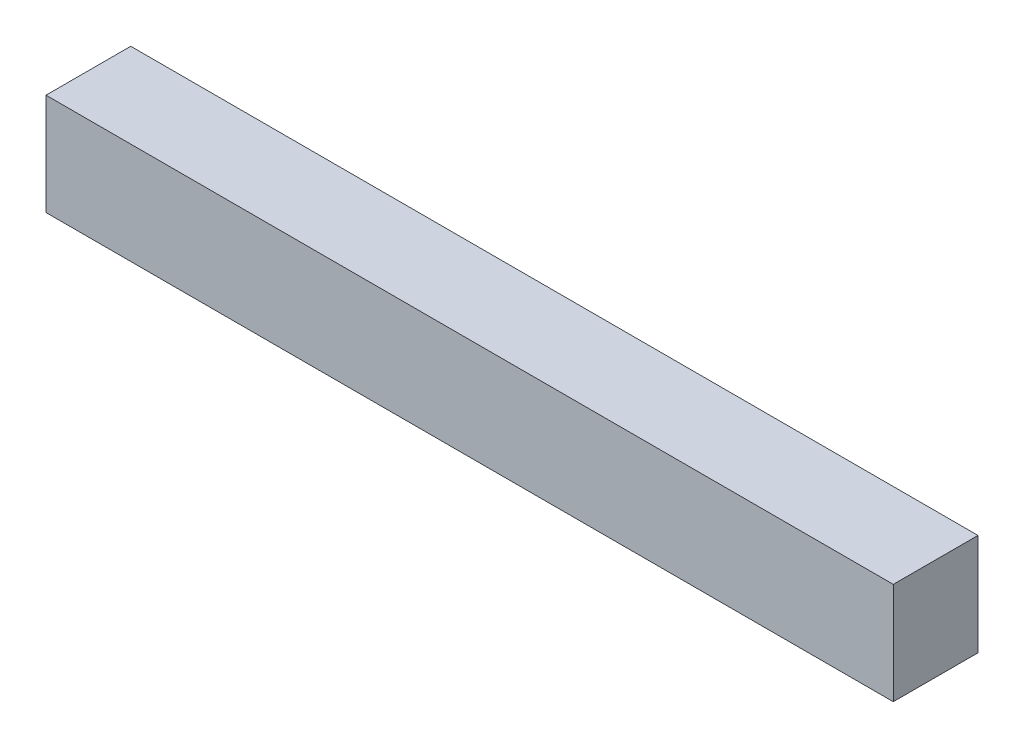
ISO-10303-21;
HEADER;
FILE_DESCRIPTION(('STEP AP214'),'2;1');
FILE_NAME('part.step','',(''),(''),'','','');
FILE_SCHEMA(('AUTOMOTIVE_DESIGN { 1 0 10303 214 1 1 1 1 }'));
ENDSEC;
DATA;
#1=APPLICATION_CONTEXT('core data for automotive mechanical design processes');
#2=APPLICATION_PROTOCOL_DEFINITION('international standard','automotive_design',2000,#1);
#3=PRODUCT_CONTEXT('',#1,'mechanical');
#4=PRODUCT('Part','Part','',(#3));
#5=PRODUCT_RELATED_PRODUCT_CATEGORY('part','',(#4));
#6=PRODUCT_DEFINITION_FORMATION('','',#4);
#7=PRODUCT_DEFINITION_CONTEXT('part definition',#1,'design');
#8=PRODUCT_DEFINITION('design','',#6,#7);
#9=PRODUCT_DEFINITION_SHAPE('','',#8);
#10=(LENGTH_UNIT() NAMED_UNIT(*) SI_UNIT(.MILLI.,.METRE.));
#11=(NAMED_UNIT(*) PLANE_ANGLE_UNIT() SI_UNIT($,.RADIAN.));
#12=(NAMED_UNIT(*) SI_UNIT($,.STERADIAN.) SOLID_ANGLE_UNIT());
#13=UNCERTAINTY_MEASURE_WITH_UNIT(LENGTH_MEASURE(1.E-05),#10,'distance_accuracy_value','');
#14=(GEOMETRIC_REPRESENTATION_CONTEXT(3) GLOBAL_UNCERTAINTY_ASSIGNED_CONTEXT((#13)) GLOBAL_UNIT_ASSIGNED_CONTEXT((#10,
#11,#12)) REPRESENTATION_CONTEXT('',''));
#15=CARTESIAN_POINT('',(0.,0.,0.));
#16=DIRECTION('',(0.,0.,1.));
#17=DIRECTION('',(1.,0.,0.));
#18=AXIS2_PLACEMENT_3D('',#15,#16,#17);
#19=CARTESIAN_POINT('',(25.,6.,-2.5));
#20=DIRECTION('',(-1.,0.,0.));
#21=DIRECTION('',(0.,0.,1.));
#22=AXIS2_PLACEMENT_3D('',#19,#20,#21);
#23=PLANE('',#22);
#24=DIRECTION('',(0.,0.,-1.));
#25=VECTOR('',#24,1.);
#26=CARTESIAN_POINT('',(25.,0.,-2.5));
#27=LINE('',#26,#25);
#28=CARTESIAN_POINT('',(25.,0.,2.5));
#29=VERTEX_POINT('',#28);
#30=CARTESIAN_POINT('',(25.,0.,-2.5));
#31=VERTEX_POINT('',#30);
#32=EDGE_CURVE('E98',#29,#31,#27,.T.);
#33=ORIENTED_EDGE('',*,*,#32,.T.);
#34=DIRECTION('',(0.,-1.,0.));
#35=VECTOR('',#34,1.);
#36=CARTESIAN_POINT('',(25.,6.,-2.5));
#37=LINE('',#36,#35);
#38=CARTESIAN_POINT('',(25.,6.,-2.5));
#39=VERTEX_POINT('',#38);
#40=EDGE_CURVE('E11',#39,#31,#37,.T.);
#41=ORIENTED_EDGE('',*,*,#40,.F.);
#42=DIRECTION('',(0.,0.,-1.));
#43=VECTOR('',#42,1.);
#44=CARTESIAN_POINT('',(25.,6.,-2.5));
#45=LINE('',#44,#43);
#46=CARTESIAN_POINT('',(25.,6.,2.5));
#47=VERTEX_POINT('',#46);
#48=EDGE_CURVE('E86',#47,#39,#45,.T.);
#49=ORIENTED_EDGE('',*,*,#48,.F.);
#50=DIRECTION('',(0.,-1.,0.));
#51=VECTOR('',#50,1.);
#52=CARTESIAN_POINT('',(25.,6.,2.5));
#53=LINE('',#52,#51);
#54=EDGE_CURVE('E94',#47,#29,#53,.T.);
#55=ORIENTED_EDGE('',*,*,#54,.T.);
#56=EDGE_LOOP('',(#33,#41,#49,#55));
#57=FACE_BOUND('',#56,.T.);
#58=ADVANCED_FACE('F35',(#57),#23,.F.);
#59=CARTESIAN_POINT('',(-25.,6.,-2.5));
#60=DIRECTION('',(0.,0.,1.));
#61=DIRECTION('',(1.,0.,0.));
#62=AXIS2_PLACEMENT_3D('',#59,#60,#61);
#63=PLANE('',#62);
#64=DIRECTION('',(-1.,0.,0.));
#65=VECTOR('',#64,1.);
#66=CARTESIAN_POINT('',(-25.,0.,-2.5));
#67=LINE('',#66,#65);
#68=CARTESIAN_POINT('',(-25.,0.,-2.5));
#69=VERTEX_POINT('',#68);
#70=EDGE_CURVE('E90',#31,#69,#67,.T.);
#71=ORIENTED_EDGE('',*,*,#70,.T.);
#72=DIRECTION('',(0.,-1.,0.));
#73=VECTOR('',#72,1.);
#74=CARTESIAN_POINT('',(-25.,6.,-2.5));
#75=LINE('',#74,#73);
#76=CARTESIAN_POINT('',(-25.,6.,-2.5));
#77=VERTEX_POINT('',#76);
#78=EDGE_CURVE('E43',#77,#69,#75,.T.);
#79=ORIENTED_EDGE('',*,*,#78,.F.);
#80=DIRECTION('',(-1.,0.,0.));
#81=VECTOR('',#80,1.);
#82=CARTESIAN_POINT('',(-25.,6.,-2.5));
#83=LINE('',#82,#81);
#84=EDGE_CURVE('E81',#39,#77,#83,.T.);
#85=ORIENTED_EDGE('',*,*,#84,.F.);
#86=ORIENTED_EDGE('',*,*,#40,.T.);
#87=EDGE_LOOP('',(#71,#79,#85,#86));
#88=FACE_BOUND('',#87,.T.);
#89=ADVANCED_FACE('F89',(#88),#63,.F.);
#90=CARTESIAN_POINT('',(-25.,6.,-2.5));
#91=DIRECTION('',(1.,0.,0.));
#92=DIRECTION('',(0.,0.,-1.));
#93=AXIS2_PLACEMENT_3D('',#90,#91,#92);
#94=PLANE('',#93);
#95=DIRECTION('',(0.,0.,1.));
#96=VECTOR('',#95,1.);
#97=CARTESIAN_POINT('',(-25.,0.,-2.5));
#98=LINE('',#97,#96);
#99=CARTESIAN_POINT('',(-25.,0.,2.5));
#100=VERTEX_POINT('',#99);
#101=EDGE_CURVE('E68',#69,#100,#98,.T.);
#102=ORIENTED_EDGE('',*,*,#101,.T.);
#103=DIRECTION('',(0.,-1.,0.));
#104=VECTOR('',#103,1.);
#105=CARTESIAN_POINT('',(-25.,6.,2.5));
#106=LINE('',#105,#104);
#107=CARTESIAN_POINT('',(-25.,6.,2.5));
#108=VERTEX_POINT('',#107);
#109=EDGE_CURVE('E91',#108,#100,#106,.T.);
#110=ORIENTED_EDGE('',*,*,#109,.F.);
#111=DIRECTION('',(0.,0.,1.));
#112=VECTOR('',#111,1.);
#113=CARTESIAN_POINT('',(-25.,6.,-2.5));
#114=LINE('',#113,#112);
#115=EDGE_CURVE('E84',#77,#108,#114,.T.);
#116=ORIENTED_EDGE('',*,*,#115,.F.);
#117=ORIENTED_EDGE('',*,*,#78,.T.);
#118=EDGE_LOOP('',(#102,#110,#116,#117));
#119=FACE_BOUND('',#118,.T.);
#120=ADVANCED_FACE('F92',(#119),#94,.F.);
#121=CARTESIAN_POINT('',(-25.,6.,2.5));
#122=DIRECTION('',(0.,0.,-1.));
#123=DIRECTION('',(-1.,0.,0.));
#124=AXIS2_PLACEMENT_3D('',#121,#122,#123);
#125=PLANE('',#124);
#126=DIRECTION('',(1.,0.,0.));
#127=VECTOR('',#126,1.);
#128=CARTESIAN_POINT('',(-25.,0.,2.5));
#129=LINE('',#128,#127);
#130=EDGE_CURVE('E74',#100,#29,#129,.T.);
#131=ORIENTED_EDGE('',*,*,#130,.T.);
#132=ORIENTED_EDGE('',*,*,#54,.F.);
#133=DIRECTION('',(1.,0.,0.));
#134=VECTOR('',#133,1.);
#135=CARTESIAN_POINT('',(-25.,6.,2.5));
#136=LINE('',#135,#134);
#137=EDGE_CURVE('E51',#108,#47,#136,.T.);
#138=ORIENTED_EDGE('',*,*,#137,.F.);
#139=ORIENTED_EDGE('',*,*,#109,.T.);
#140=EDGE_LOOP('',(#131,#132,#138,#139));
#141=FACE_BOUND('',#140,.T.);
#142=ADVANCED_FACE('F105',(#141),#125,.F.);
#143=CARTESIAN_POINT('',(0.,6.,0.));
#144=DIRECTION('',(0.,1.,0.));
#145=DIRECTION('',(0.,0.,1.));
#146=AXIS2_PLACEMENT_3D('',#143,#144,#145);
#147=PLANE('',#146);
#148=ORIENTED_EDGE('',*,*,#48,.T.);
#149=ORIENTED_EDGE('',*,*,#84,.T.);
#150=ORIENTED_EDGE('',*,*,#115,.T.);
#151=ORIENTED_EDGE('',*,*,#137,.T.);
#152=EDGE_LOOP('',(#148,#149,#150,#151));
#153=FACE_BOUND('',#152,.T.);
#154=ADVANCED_FACE('F82',(#153),#147,.T.);
#155=CARTESIAN_POINT('',(0.,0.,0.));
#156=DIRECTION('',(0.,1.,0.));
#157=DIRECTION('',(0.,0.,1.));
#158=AXIS2_PLACEMENT_3D('',#155,#156,#157);
#159=PLANE('',#158);
#160=ORIENTED_EDGE('',*,*,#32,.F.);
#161=ORIENTED_EDGE('',*,*,#130,.F.);
#162=ORIENTED_EDGE('',*,*,#101,.F.);
#163=ORIENTED_EDGE('',*,*,#70,.F.);
#164=EDGE_LOOP('',(#160,#161,#162,#163));
#165=FACE_BOUND('',#164,.T.);
#166=ADVANCED_FACE('F108',(#165),#159,.F.);
#167=CLOSED_SHELL('',(#58,#89,#120,#142,#154,#166));
#168=MANIFOLD_SOLID_BREP('B2',#167);
#169=ADVANCED_BREP_SHAPE_REPRESENTATION('',(#18,#168),#14);
#170=SHAPE_DEFINITION_REPRESENTATION(#9,#169);
ENDSEC;
END-ISO-10303-21;
